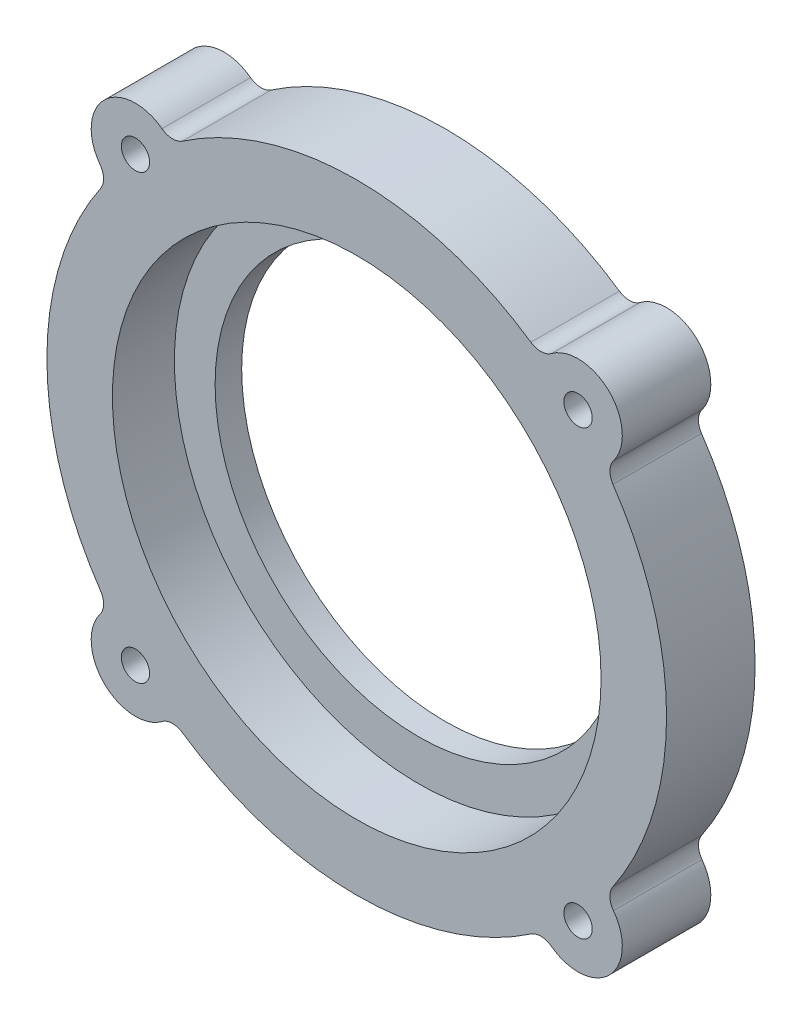
ISO-10303-21;
HEADER;
FILE_DESCRIPTION(('STEP AP214'),'2;1');
FILE_NAME('part.step','',(''),(''),'','','');
FILE_SCHEMA(('AUTOMOTIVE_DESIGN { 1 0 10303 214 1 1 1 1 }'));
ENDSEC;
DATA;
#1=APPLICATION_CONTEXT('core data for automotive mechanical design processes');
#2=APPLICATION_PROTOCOL_DEFINITION('international standard','automotive_design',2000,#1);
#3=PRODUCT_CONTEXT('',#1,'mechanical');
#4=PRODUCT('Part','Part','',(#3));
#5=PRODUCT_RELATED_PRODUCT_CATEGORY('part','',(#4));
#6=PRODUCT_DEFINITION_FORMATION('','',#4);
#7=PRODUCT_DEFINITION_CONTEXT('part definition',#1,'design');
#8=PRODUCT_DEFINITION('design','',#6,#7);
#9=PRODUCT_DEFINITION_SHAPE('','',#8);
#10=(LENGTH_UNIT() NAMED_UNIT(*) SI_UNIT(.MILLI.,.METRE.));
#11=(NAMED_UNIT(*) PLANE_ANGLE_UNIT() SI_UNIT($,.RADIAN.));
#12=(NAMED_UNIT(*) SI_UNIT($,.STERADIAN.) SOLID_ANGLE_UNIT());
#13=UNCERTAINTY_MEASURE_WITH_UNIT(LENGTH_MEASURE(1.E-05),#10,'distance_accuracy_value','');
#14=(GEOMETRIC_REPRESENTATION_CONTEXT(3) GLOBAL_UNCERTAINTY_ASSIGNED_CONTEXT((#13)) GLOBAL_UNIT_ASSIGNED_CONTEXT((#10,
#11,#12)) REPRESENTATION_CONTEXT('',''));
#15=CARTESIAN_POINT('',(0.,0.,0.));
#16=DIRECTION('',(0.,0.,1.));
#17=DIRECTION('',(1.,0.,0.));
#18=AXIS2_PLACEMENT_3D('',#15,#16,#17);
#19=CARTESIAN_POINT('',(0.,0.,10.));
#20=DIRECTION('',(0.,0.,-1.));
#21=DIRECTION('',(-1.,0.,0.));
#22=AXIS2_PLACEMENT_3D('',#19,#20,#21);
#23=CYLINDRICAL_SURFACE('',#22,23.);
#24=CARTESIAN_POINT('',(0.,0.,0.));
#25=DIRECTION('',(0.,0.,1.));
#26=DIRECTION('',(1.,0.,0.));
#27=AXIS2_PLACEMENT_3D('',#24,#25,#26);
#28=CIRCLE('',#27,23.);
#29=CARTESIAN_POINT('',(23.,0.,0.));
#30=VERTEX_POINT('',#29);
#31=EDGE_CURVE('E184',#30,#30,#28,.T.);
#32=ORIENTED_EDGE('',*,*,#31,.F.);
#33=EDGE_LOOP('',(#32));
#34=FACE_BOUND('',#33,.T.);
#35=CARTESIAN_POINT('',(0.,0.,3.));
#36=DIRECTION('',(0.,0.,1.));
#37=DIRECTION('',(1.,0.,0.));
#38=AXIS2_PLACEMENT_3D('',#35,#36,#37);
#39=CIRCLE('',#38,23.);
#40=CARTESIAN_POINT('',(23.,0.,3.));
#41=VERTEX_POINT('',#40);
#42=EDGE_CURVE('E37',#41,#41,#39,.T.);
#43=ORIENTED_EDGE('',*,*,#42,.T.);
#44=EDGE_LOOP('',(#43));
#45=FACE_BOUND('',#44,.T.);
#46=ADVANCED_FACE('F33',(#34,#45),#23,.F.);
#47=CARTESIAN_POINT('',(-27.8,-22.9,10.));
#48=DIRECTION('',(0.,0.,-1.));
#49=DIRECTION('',(-1.,0.,0.));
#50=AXIS2_PLACEMENT_3D('',#47,#48,#49);
#51=PLANE('',#50);
#52=CARTESIAN_POINT('',(0.,0.,10.));
#53=DIRECTION('',(0.,0.,1.));
#54=DIRECTION('',(1.,0.,0.));
#55=AXIS2_PLACEMENT_3D('',#52,#53,#54);
#56=CIRCLE('',#55,27.6);
#57=CARTESIAN_POINT('',(27.6,0.,10.));
#58=VERTEX_POINT('',#57);
#59=EDGE_CURVE('E441',#58,#58,#56,.T.);
#60=ORIENTED_EDGE('',*,*,#59,.F.);
#61=EDGE_LOOP('',(#60));
#62=FACE_BOUND('',#61,.T.);
#63=CARTESIAN_POINT('',(-30.6,-20.8,10.));
#64=DIRECTION('',(0.,0.,-1.));
#65=DIRECTION('',(-1.,0.,0.));
#66=AXIS2_PLACEMENT_3D('',#63,#64,#65);
#67=CIRCLE('',#66,2.);
#68=CARTESIAN_POINT('',(-28.945945945946,-19.6756756756757,10.));
#69=VERTEX_POINT('',#68);
#70=CARTESIAN_POINT('',(-29.,-22.,10.));
#71=VERTEX_POINT('',#70);
#72=EDGE_CURVE('E211',#69,#71,#67,.T.);
#73=ORIENTED_EDGE('',*,*,#72,.T.);
#74=CARTESIAN_POINT('',(-25.,-25.,10.));
#75=DIRECTION('',(0.,0.,1.));
#76=DIRECTION('',(1.,0.,0.));
#77=AXIS2_PLACEMENT_3D('',#74,#75,#76);
#78=CIRCLE('',#77,5.00000000000002);
#79=CARTESIAN_POINT('',(-22.,-29.,10.));
#80=VERTEX_POINT('',#79);
#81=EDGE_CURVE('E118',#71,#80,#78,.T.);
#82=ORIENTED_EDGE('',*,*,#81,.T.);
#83=CARTESIAN_POINT('',(-20.8,-30.6,10.));
#84=DIRECTION('',(0.,0.,-1.));
#85=DIRECTION('',(-1.,0.,0.));
#86=AXIS2_PLACEMENT_3D('',#83,#84,#85);
#87=CIRCLE('',#86,2.);
#88=CARTESIAN_POINT('',(-19.6756756756757,-28.945945945946,10.));
#89=VERTEX_POINT('',#88);
#90=EDGE_CURVE('E251',#80,#89,#87,.T.);
#91=ORIENTED_EDGE('',*,*,#90,.T.);
#92=CARTESIAN_POINT('',(0.,0.,10.));
#93=DIRECTION('',(0.,0.,1.));
#94=DIRECTION('',(1.,0.,0.));
#95=AXIS2_PLACEMENT_3D('',#92,#93,#94);
#96=CIRCLE('',#95,35.);
#97=CARTESIAN_POINT('',(19.6756756756757,-28.945945945946,10.));
#98=VERTEX_POINT('',#97);
#99=EDGE_CURVE('E270',#89,#98,#96,.T.);
#100=ORIENTED_EDGE('',*,*,#99,.T.);
#101=CARTESIAN_POINT('',(20.8,-30.6,10.));
#102=DIRECTION('',(0.,0.,-1.));
#103=DIRECTION('',(-1.,0.,0.));
#104=AXIS2_PLACEMENT_3D('',#101,#102,#103);
#105=CIRCLE('',#104,2.);
#106=CARTESIAN_POINT('',(22.,-29.,10.));
#107=VERTEX_POINT('',#106);
#108=EDGE_CURVE('E267',#98,#107,#105,.T.);
#109=ORIENTED_EDGE('',*,*,#108,.T.);
#110=CARTESIAN_POINT('',(25.,-25.,10.));
#111=DIRECTION('',(0.,0.,1.));
#112=DIRECTION('',(1.,0.,0.));
#113=AXIS2_PLACEMENT_3D('',#110,#111,#112);
#114=CIRCLE('',#113,5.00000000000002);
#115=CARTESIAN_POINT('',(29.,-22.,10.));
#116=VERTEX_POINT('',#115);
#117=EDGE_CURVE('E269',#107,#116,#114,.T.);
#118=ORIENTED_EDGE('',*,*,#117,.T.);
#119=CARTESIAN_POINT('',(30.6,-20.8,10.));
#120=DIRECTION('',(0.,0.,-1.));
#121=DIRECTION('',(-1.,0.,0.));
#122=AXIS2_PLACEMENT_3D('',#119,#120,#121);
#123=CIRCLE('',#122,2.);
#124=CARTESIAN_POINT('',(28.945945945946,-19.6756756756757,10.));
#125=VERTEX_POINT('',#124);
#126=EDGE_CURVE('E272',#116,#125,#123,.T.);
#127=ORIENTED_EDGE('',*,*,#126,.T.);
#128=CARTESIAN_POINT('',(0.,0.,10.));
#129=DIRECTION('',(0.,0.,1.));
#130=DIRECTION('',(1.,0.,0.));
#131=AXIS2_PLACEMENT_3D('',#128,#129,#130);
#132=CIRCLE('',#131,35.);
#133=CARTESIAN_POINT('',(28.9459459459459,19.6756756756757,10.));
#134=VERTEX_POINT('',#133);
#135=EDGE_CURVE('E278',#125,#134,#132,.T.);
#136=ORIENTED_EDGE('',*,*,#135,.T.);
#137=CARTESIAN_POINT('',(30.6,20.8,10.));
#138=DIRECTION('',(0.,0.,-1.));
#139=DIRECTION('',(-1.,0.,0.));
#140=AXIS2_PLACEMENT_3D('',#137,#138,#139);
#141=CIRCLE('',#140,2.);
#142=CARTESIAN_POINT('',(29.,22.,10.));
#143=VERTEX_POINT('',#142);
#144=EDGE_CURVE('E280',#134,#143,#141,.T.);
#145=ORIENTED_EDGE('',*,*,#144,.T.);
#146=CARTESIAN_POINT('',(25.,25.,10.));
#147=DIRECTION('',(0.,0.,1.));
#148=DIRECTION('',(1.,0.,0.));
#149=AXIS2_PLACEMENT_3D('',#146,#147,#148);
#150=CIRCLE('',#149,5.00000000000001);
#151=CARTESIAN_POINT('',(22.,29.,10.));
#152=VERTEX_POINT('',#151);
#153=EDGE_CURVE('E282',#143,#152,#150,.T.);
#154=ORIENTED_EDGE('',*,*,#153,.T.);
#155=CARTESIAN_POINT('',(20.8,30.6,10.));
#156=DIRECTION('',(0.,0.,-1.));
#157=DIRECTION('',(-1.,0.,0.));
#158=AXIS2_PLACEMENT_3D('',#155,#156,#157);
#159=CIRCLE('',#158,2.);
#160=CARTESIAN_POINT('',(19.6756756756757,28.945945945946,10.));
#161=VERTEX_POINT('',#160);
#162=EDGE_CURVE('E284',#152,#161,#159,.T.);
#163=ORIENTED_EDGE('',*,*,#162,.T.);
#164=CARTESIAN_POINT('',(0.,0.,10.));
#165=DIRECTION('',(0.,0.,1.));
#166=DIRECTION('',(1.,0.,0.));
#167=AXIS2_PLACEMENT_3D('',#164,#165,#166);
#168=CIRCLE('',#167,35.);
#169=CARTESIAN_POINT('',(-19.6756756756757,28.9459459459459,10.));
#170=VERTEX_POINT('',#169);
#171=EDGE_CURVE('E286',#161,#170,#168,.T.);
#172=ORIENTED_EDGE('',*,*,#171,.T.);
#173=CARTESIAN_POINT('',(-20.8,30.6,10.));
#174=DIRECTION('',(0.,0.,-1.));
#175=DIRECTION('',(-1.,0.,0.));
#176=AXIS2_PLACEMENT_3D('',#173,#174,#175);
#177=CIRCLE('',#176,2.);
#178=CARTESIAN_POINT('',(-22.,29.,10.));
#179=VERTEX_POINT('',#178);
#180=EDGE_CURVE('E162',#170,#179,#177,.T.);
#181=ORIENTED_EDGE('',*,*,#180,.T.);
#182=CARTESIAN_POINT('',(-25.,25.,10.));
#183=DIRECTION('',(0.,0.,1.));
#184=DIRECTION('',(1.,0.,0.));
#185=AXIS2_PLACEMENT_3D('',#182,#183,#184);
#186=CIRCLE('',#185,4.99999999999999);
#187=CARTESIAN_POINT('',(-29.,22.,10.));
#188=VERTEX_POINT('',#187);
#189=EDGE_CURVE('E155',#179,#188,#186,.T.);
#190=ORIENTED_EDGE('',*,*,#189,.T.);
#191=CARTESIAN_POINT('',(-30.6,20.8,10.));
#192=DIRECTION('',(0.,0.,-1.));
#193=DIRECTION('',(1.,0.,0.));
#194=AXIS2_PLACEMENT_3D('',#191,#192,#193);
#195=CIRCLE('',#194,2.);
#196=CARTESIAN_POINT('',(-28.945945945946,19.6756756756757,10.));
#197=VERTEX_POINT('',#196);
#198=EDGE_CURVE('E160',#188,#197,#195,.T.);
#199=ORIENTED_EDGE('',*,*,#198,.T.);
#200=CARTESIAN_POINT('',(0.,0.,10.));
#201=DIRECTION('',(0.,0.,1.));
#202=DIRECTION('',(1.,0.,0.));
#203=AXIS2_PLACEMENT_3D('',#200,#201,#202);
#204=CIRCLE('',#203,35.);
#205=EDGE_CURVE('E51',#197,#69,#204,.T.);
#206=ORIENTED_EDGE('',*,*,#205,.T.);
#207=EDGE_LOOP('',(#73,#82,#91,#100,#109,#118,#127,#136,#145,#154,#163,#172,#181,#190,#199,#206));
#208=FACE_BOUND('',#207,.T.);
#209=CARTESIAN_POINT('',(-25.,25.,10.));
#210=DIRECTION('',(0.,0.,1.));
#211=DIRECTION('',(1.,0.,0.));
#212=AXIS2_PLACEMENT_3D('',#209,#210,#211);
#213=CIRCLE('',#212,1.6);
#214=CARTESIAN_POINT('',(-23.4,25.,10.));
#215=VERTEX_POINT('',#214);
#216=EDGE_CURVE('E338',#215,#215,#213,.T.);
#217=ORIENTED_EDGE('',*,*,#216,.F.);
#218=EDGE_LOOP('',(#217));
#219=FACE_BOUND('',#218,.T.);
#220=CARTESIAN_POINT('',(25.,25.,10.));
#221=DIRECTION('',(0.,0.,1.));
#222=DIRECTION('',(1.,0.,0.));
#223=AXIS2_PLACEMENT_3D('',#220,#221,#222);
#224=CIRCLE('',#223,1.6);
#225=CARTESIAN_POINT('',(26.6,25.,10.));
#226=VERTEX_POINT('',#225);
#227=EDGE_CURVE('E339',#226,#226,#224,.T.);
#228=ORIENTED_EDGE('',*,*,#227,.F.);
#229=EDGE_LOOP('',(#228));
#230=FACE_BOUND('',#229,.T.);
#231=CARTESIAN_POINT('',(-25.,-25.,10.));
#232=DIRECTION('',(0.,0.,1.));
#233=DIRECTION('',(1.,0.,0.));
#234=AXIS2_PLACEMENT_3D('',#231,#232,#233);
#235=CIRCLE('',#234,1.6);
#236=CARTESIAN_POINT('',(-23.4,-25.,10.));
#237=VERTEX_POINT('',#236);
#238=EDGE_CURVE('E367',#237,#237,#235,.T.);
#239=ORIENTED_EDGE('',*,*,#238,.F.);
#240=EDGE_LOOP('',(#239));
#241=FACE_BOUND('',#240,.T.);
#242=CARTESIAN_POINT('',(25.,-25.,10.));
#243=DIRECTION('',(0.,0.,1.));
#244=DIRECTION('',(1.,0.,0.));
#245=AXIS2_PLACEMENT_3D('',#242,#243,#244);
#246=CIRCLE('',#245,1.6);
#247=CARTESIAN_POINT('',(26.6,-25.,10.));
#248=VERTEX_POINT('',#247);
#249=EDGE_CURVE('E359',#248,#248,#246,.T.);
#250=ORIENTED_EDGE('',*,*,#249,.F.);
#251=EDGE_LOOP('',(#250));
#252=FACE_BOUND('',#251,.T.);
#253=ADVANCED_FACE('F157',(#62,#208,#219,#230,#241,#252),#51,.F.);
#254=CARTESIAN_POINT('',(-27.8,-22.9,0.));
#255=DIRECTION('',(0.,0.,-1.));
#256=DIRECTION('',(-1.,0.,0.));
#257=AXIS2_PLACEMENT_3D('',#254,#255,#256);
#258=PLANE('',#257);
#259=CARTESIAN_POINT('',(-25.,-25.,0.));
#260=DIRECTION('',(0.,0.,1.));
#261=DIRECTION('',(1.,0.,0.));
#262=AXIS2_PLACEMENT_3D('',#259,#260,#261);
#263=CIRCLE('',#262,1.6);
#264=CARTESIAN_POINT('',(-23.4,-25.,0.));
#265=VERTEX_POINT('',#264);
#266=EDGE_CURVE('E333',#265,#265,#263,.T.);
#267=ORIENTED_EDGE('',*,*,#266,.T.);
#268=EDGE_LOOP('',(#267));
#269=FACE_BOUND('',#268,.T.);
#270=CARTESIAN_POINT('',(-25.,25.,0.));
#271=DIRECTION('',(0.,0.,1.));
#272=DIRECTION('',(1.,0.,0.));
#273=AXIS2_PLACEMENT_3D('',#270,#271,#272);
#274=CIRCLE('',#273,1.6);
#275=CARTESIAN_POINT('',(-23.4,25.,0.));
#276=VERTEX_POINT('',#275);
#277=EDGE_CURVE('E336',#276,#276,#274,.T.);
#278=ORIENTED_EDGE('',*,*,#277,.T.);
#279=EDGE_LOOP('',(#278));
#280=FACE_BOUND('',#279,.T.);
#281=CARTESIAN_POINT('',(-30.6,-20.8,0.));
#282=DIRECTION('',(0.,0.,-1.));
#283=DIRECTION('',(-1.,0.,0.));
#284=AXIS2_PLACEMENT_3D('',#281,#282,#283);
#285=CIRCLE('',#284,2.);
#286=CARTESIAN_POINT('',(-28.945945945946,-19.6756756756757,0.));
#287=VERTEX_POINT('',#286);
#288=CARTESIAN_POINT('',(-29.,-22.,0.));
#289=VERTEX_POINT('',#288);
#290=EDGE_CURVE('E180',#287,#289,#285,.T.);
#291=ORIENTED_EDGE('',*,*,#290,.F.);
#292=CARTESIAN_POINT('',(0.,0.,0.));
#293=DIRECTION('',(0.,0.,1.));
#294=DIRECTION('',(1.,0.,0.));
#295=AXIS2_PLACEMENT_3D('',#292,#293,#294);
#296=CIRCLE('',#295,35.);
#297=CARTESIAN_POINT('',(-28.945945945946,19.6756756756757,0.));
#298=VERTEX_POINT('',#297);
#299=EDGE_CURVE('E110',#298,#287,#296,.T.);
#300=ORIENTED_EDGE('',*,*,#299,.F.);
#301=CARTESIAN_POINT('',(-30.6,20.8,0.));
#302=DIRECTION('',(0.,0.,-1.));
#303=DIRECTION('',(1.,0.,0.));
#304=AXIS2_PLACEMENT_3D('',#301,#302,#303);
#305=CIRCLE('',#304,2.);
#306=CARTESIAN_POINT('',(-29.,22.,0.));
#307=VERTEX_POINT('',#306);
#308=EDGE_CURVE('E104',#307,#298,#305,.T.);
#309=ORIENTED_EDGE('',*,*,#308,.F.);
#310=CARTESIAN_POINT('',(-25.,25.,0.));
#311=DIRECTION('',(0.,0.,1.));
#312=DIRECTION('',(1.,0.,0.));
#313=AXIS2_PLACEMENT_3D('',#310,#311,#312);
#314=CIRCLE('',#313,4.99999999999999);
#315=CARTESIAN_POINT('',(-22.,29.,0.));
#316=VERTEX_POINT('',#315);
#317=EDGE_CURVE('E170',#316,#307,#314,.T.);
#318=ORIENTED_EDGE('',*,*,#317,.F.);
#319=CARTESIAN_POINT('',(-20.8,30.6,0.));
#320=DIRECTION('',(0.,0.,-1.));
#321=DIRECTION('',(-1.,0.,0.));
#322=AXIS2_PLACEMENT_3D('',#319,#320,#321);
#323=CIRCLE('',#322,2.);
#324=CARTESIAN_POINT('',(-19.6756756756757,28.9459459459459,0.));
#325=VERTEX_POINT('',#324);
#326=EDGE_CURVE('E206',#325,#316,#323,.T.);
#327=ORIENTED_EDGE('',*,*,#326,.F.);
#328=CARTESIAN_POINT('',(0.,0.,0.));
#329=DIRECTION('',(0.,0.,1.));
#330=DIRECTION('',(1.,0.,0.));
#331=AXIS2_PLACEMENT_3D('',#328,#329,#330);
#332=CIRCLE('',#331,35.);
#333=CARTESIAN_POINT('',(19.6756756756757,28.945945945946,0.));
#334=VERTEX_POINT('',#333);
#335=EDGE_CURVE('E204',#334,#325,#332,.T.);
#336=ORIENTED_EDGE('',*,*,#335,.F.);
#337=CARTESIAN_POINT('',(20.8,30.6,0.));
#338=DIRECTION('',(0.,0.,-1.));
#339=DIRECTION('',(-1.,0.,0.));
#340=AXIS2_PLACEMENT_3D('',#337,#338,#339);
#341=CIRCLE('',#340,2.);
#342=CARTESIAN_POINT('',(22.,29.,0.));
#343=VERTEX_POINT('',#342);
#344=EDGE_CURVE('E202',#343,#334,#341,.T.);
#345=ORIENTED_EDGE('',*,*,#344,.F.);
#346=CARTESIAN_POINT('',(25.,25.,0.));
#347=DIRECTION('',(0.,0.,1.));
#348=DIRECTION('',(1.,0.,0.));
#349=AXIS2_PLACEMENT_3D('',#346,#347,#348);
#350=CIRCLE('',#349,5.00000000000001);
#351=CARTESIAN_POINT('',(29.,22.,0.));
#352=VERTEX_POINT('',#351);
#353=EDGE_CURVE('E200',#352,#343,#350,.T.);
#354=ORIENTED_EDGE('',*,*,#353,.F.);
#355=CARTESIAN_POINT('',(30.6,20.8,0.));
#356=DIRECTION('',(0.,0.,-1.));
#357=DIRECTION('',(-1.,0.,0.));
#358=AXIS2_PLACEMENT_3D('',#355,#356,#357);
#359=CIRCLE('',#358,2.);
#360=CARTESIAN_POINT('',(28.9459459459459,19.6756756756757,0.));
#361=VERTEX_POINT('',#360);
#362=EDGE_CURVE('E198',#361,#352,#359,.T.);
#363=ORIENTED_EDGE('',*,*,#362,.F.);
#364=CARTESIAN_POINT('',(0.,0.,0.));
#365=DIRECTION('',(0.,0.,1.));
#366=DIRECTION('',(1.,0.,0.));
#367=AXIS2_PLACEMENT_3D('',#364,#365,#366);
#368=CIRCLE('',#367,35.);
#369=CARTESIAN_POINT('',(28.945945945946,-19.6756756756757,0.));
#370=VERTEX_POINT('',#369);
#371=EDGE_CURVE('E196',#370,#361,#368,.T.);
#372=ORIENTED_EDGE('',*,*,#371,.F.);
#373=CARTESIAN_POINT('',(30.6,-20.8,0.));
#374=DIRECTION('',(0.,0.,-1.));
#375=DIRECTION('',(-1.,0.,0.));
#376=AXIS2_PLACEMENT_3D('',#373,#374,#375);
#377=CIRCLE('',#376,2.);
#378=CARTESIAN_POINT('',(29.,-22.,0.));
#379=VERTEX_POINT('',#378);
#380=EDGE_CURVE('E194',#379,#370,#377,.T.);
#381=ORIENTED_EDGE('',*,*,#380,.F.);
#382=CARTESIAN_POINT('',(25.,-25.,0.));
#383=DIRECTION('',(0.,0.,1.));
#384=DIRECTION('',(1.,0.,0.));
#385=AXIS2_PLACEMENT_3D('',#382,#383,#384);
#386=CIRCLE('',#385,5.00000000000002);
#387=CARTESIAN_POINT('',(22.,-29.,0.));
#388=VERTEX_POINT('',#387);
#389=EDGE_CURVE('E192',#388,#379,#386,.T.);
#390=ORIENTED_EDGE('',*,*,#389,.F.);
#391=CARTESIAN_POINT('',(20.8,-30.6,0.));
#392=DIRECTION('',(0.,0.,-1.));
#393=DIRECTION('',(-1.,0.,0.));
#394=AXIS2_PLACEMENT_3D('',#391,#392,#393);
#395=CIRCLE('',#394,2.);
#396=CARTESIAN_POINT('',(19.6756756756757,-28.945945945946,0.));
#397=VERTEX_POINT('',#396);
#398=EDGE_CURVE('E190',#397,#388,#395,.T.);
#399=ORIENTED_EDGE('',*,*,#398,.F.);
#400=CARTESIAN_POINT('',(0.,0.,0.));
#401=DIRECTION('',(0.,0.,1.));
#402=DIRECTION('',(1.,0.,0.));
#403=AXIS2_PLACEMENT_3D('',#400,#401,#402);
#404=CIRCLE('',#403,35.);
#405=CARTESIAN_POINT('',(-19.6756756756757,-28.945945945946,0.));
#406=VERTEX_POINT('',#405);
#407=EDGE_CURVE('E188',#406,#397,#404,.T.);
#408=ORIENTED_EDGE('',*,*,#407,.F.);
#409=CARTESIAN_POINT('',(-20.8,-30.6,0.));
#410=DIRECTION('',(0.,0.,-1.));
#411=DIRECTION('',(-1.,0.,0.));
#412=AXIS2_PLACEMENT_3D('',#409,#410,#411);
#413=CIRCLE('',#412,2.);
#414=CARTESIAN_POINT('',(-22.,-29.,0.));
#415=VERTEX_POINT('',#414);
#416=EDGE_CURVE('E186',#415,#406,#413,.T.);
#417=ORIENTED_EDGE('',*,*,#416,.F.);
#418=CARTESIAN_POINT('',(-25.,-25.,0.));
#419=DIRECTION('',(0.,0.,1.));
#420=DIRECTION('',(1.,0.,0.));
#421=AXIS2_PLACEMENT_3D('',#418,#419,#420);
#422=CIRCLE('',#421,5.00000000000002);
#423=EDGE_CURVE('E183',#289,#415,#422,.T.);
#424=ORIENTED_EDGE('',*,*,#423,.F.);
#425=EDGE_LOOP('',(#291,#300,#309,#318,#327,#336,#345,#354,#363,#372,#381,#390,#399,#408,#417,#424));
#426=FACE_BOUND('',#425,.T.);
#427=ORIENTED_EDGE('',*,*,#31,.T.);
#428=EDGE_LOOP('',(#427));
#429=FACE_BOUND('',#428,.T.);
#430=CARTESIAN_POINT('',(25.,25.,0.));
#431=DIRECTION('',(0.,0.,1.));
#432=DIRECTION('',(1.,0.,0.));
#433=AXIS2_PLACEMENT_3D('',#430,#431,#432);
#434=CIRCLE('',#433,1.6);
#435=CARTESIAN_POINT('',(26.6,25.,0.));
#436=VERTEX_POINT('',#435);
#437=EDGE_CURVE('E344',#436,#436,#434,.T.);
#438=ORIENTED_EDGE('',*,*,#437,.T.);
#439=EDGE_LOOP('',(#438));
#440=FACE_BOUND('',#439,.T.);
#441=CARTESIAN_POINT('',(25.,-25.,0.));
#442=DIRECTION('',(0.,0.,1.));
#443=DIRECTION('',(1.,0.,0.));
#444=AXIS2_PLACEMENT_3D('',#441,#442,#443);
#445=CIRCLE('',#444,1.6);
#446=CARTESIAN_POINT('',(26.6,-25.,0.));
#447=VERTEX_POINT('',#446);
#448=EDGE_CURVE('E357',#447,#447,#445,.T.);
#449=ORIENTED_EDGE('',*,*,#448,.T.);
#450=EDGE_LOOP('',(#449));
#451=FACE_BOUND('',#450,.T.);
#452=ADVANCED_FACE('F255',(#269,#280,#426,#429,#440,#451),#258,.T.);
#453=CARTESIAN_POINT('',(-30.6,-20.8,10.));
#454=DIRECTION('',(0.,0.,-1.));
#455=DIRECTION('',(-1.,0.,0.));
#456=AXIS2_PLACEMENT_3D('',#453,#454,#455);
#457=CYLINDRICAL_SURFACE('',#456,2.);
#458=ORIENTED_EDGE('',*,*,#290,.T.);
#459=DIRECTION('',(0.,0.,-1.));
#460=VECTOR('',#459,1.);
#461=CARTESIAN_POINT('',(-29.,-22.,10.));
#462=LINE('',#461,#460);
#463=EDGE_CURVE('E11',#71,#289,#462,.T.);
#464=ORIENTED_EDGE('',*,*,#463,.F.);
#465=ORIENTED_EDGE('',*,*,#72,.F.);
#466=DIRECTION('',(0.,0.,-1.));
#467=VECTOR('',#466,1.);
#468=CARTESIAN_POINT('',(-28.945945945946,-19.6756756756757,10.));
#469=LINE('',#468,#467);
#470=EDGE_CURVE('E176',#69,#287,#469,.T.);
#471=ORIENTED_EDGE('',*,*,#470,.T.);
#472=EDGE_LOOP('',(#458,#464,#465,#471));
#473=FACE_BOUND('',#472,.T.);
#474=ADVANCED_FACE('F35',(#473),#457,.F.);
#475=CARTESIAN_POINT('',(-25.,-25.,10.));
#476=DIRECTION('',(0.,0.,-1.));
#477=DIRECTION('',(-1.,0.,0.));
#478=AXIS2_PLACEMENT_3D('',#475,#476,#477);
#479=CYLINDRICAL_SURFACE('',#478,5.00000000000002);
#480=ORIENTED_EDGE('',*,*,#423,.T.);
#481=DIRECTION('',(0.,0.,-1.));
#482=VECTOR('',#481,1.);
#483=CARTESIAN_POINT('',(-22.,-29.,10.));
#484=LINE('',#483,#482);
#485=EDGE_CURVE('E43',#80,#415,#484,.T.);
#486=ORIENTED_EDGE('',*,*,#485,.F.);
#487=ORIENTED_EDGE('',*,*,#81,.F.);
#488=ORIENTED_EDGE('',*,*,#463,.T.);
#489=EDGE_LOOP('',(#480,#486,#487,#488));
#490=FACE_BOUND('',#489,.T.);
#491=ADVANCED_FACE('F329',(#490),#479,.T.);
#492=CARTESIAN_POINT('',(-20.8,-30.6,10.));
#493=DIRECTION('',(0.,0.,-1.));
#494=DIRECTION('',(-1.,0.,0.));
#495=AXIS2_PLACEMENT_3D('',#492,#493,#494);
#496=CYLINDRICAL_SURFACE('',#495,2.);
#497=ORIENTED_EDGE('',*,*,#416,.T.);
#498=DIRECTION('',(0.,0.,-1.));
#499=VECTOR('',#498,1.);
#500=CARTESIAN_POINT('',(-19.6756756756757,-28.945945945946,10.));
#501=LINE('',#500,#499);
#502=EDGE_CURVE('E242',#89,#406,#501,.T.);
#503=ORIENTED_EDGE('',*,*,#502,.F.);
#504=ORIENTED_EDGE('',*,*,#90,.F.);
#505=ORIENTED_EDGE('',*,*,#485,.T.);
#506=EDGE_LOOP('',(#497,#503,#504,#505));
#507=FACE_BOUND('',#506,.T.);
#508=ADVANCED_FACE('F249',(#507),#496,.F.);
#509=CARTESIAN_POINT('',(0.,0.,10.));
#510=DIRECTION('',(0.,0.,-1.));
#511=DIRECTION('',(-1.,0.,0.));
#512=AXIS2_PLACEMENT_3D('',#509,#510,#511);
#513=CYLINDRICAL_SURFACE('',#512,35.);
#514=ORIENTED_EDGE('',*,*,#407,.T.);
#515=DIRECTION('',(0.,0.,-1.));
#516=VECTOR('',#515,1.);
#517=CARTESIAN_POINT('',(19.6756756756757,-28.945945945946,10.));
#518=LINE('',#517,#516);
#519=EDGE_CURVE('E239',#98,#397,#518,.T.);
#520=ORIENTED_EDGE('',*,*,#519,.F.);
#521=ORIENTED_EDGE('',*,*,#99,.F.);
#522=ORIENTED_EDGE('',*,*,#502,.T.);
#523=EDGE_LOOP('',(#514,#520,#521,#522));
#524=FACE_BOUND('',#523,.T.);
#525=ADVANCED_FACE('F261',(#524),#513,.T.);
#526=CARTESIAN_POINT('',(20.8,-30.6,10.));
#527=DIRECTION('',(0.,0.,-1.));
#528=DIRECTION('',(-1.,0.,0.));
#529=AXIS2_PLACEMENT_3D('',#526,#527,#528);
#530=CYLINDRICAL_SURFACE('',#529,2.);
#531=ORIENTED_EDGE('',*,*,#398,.T.);
#532=DIRECTION('',(0.,0.,-1.));
#533=VECTOR('',#532,1.);
#534=CARTESIAN_POINT('',(22.,-29.,10.));
#535=LINE('',#534,#533);
#536=EDGE_CURVE('E236',#107,#388,#535,.T.);
#537=ORIENTED_EDGE('',*,*,#536,.F.);
#538=ORIENTED_EDGE('',*,*,#108,.F.);
#539=ORIENTED_EDGE('',*,*,#519,.T.);
#540=EDGE_LOOP('',(#531,#537,#538,#539));
#541=FACE_BOUND('',#540,.T.);
#542=ADVANCED_FACE('F265',(#541),#530,.F.);
#543=CARTESIAN_POINT('',(25.,-25.,10.));
#544=DIRECTION('',(0.,0.,-1.));
#545=DIRECTION('',(-1.,0.,0.));
#546=AXIS2_PLACEMENT_3D('',#543,#544,#545);
#547=CYLINDRICAL_SURFACE('',#546,5.00000000000002);
#548=ORIENTED_EDGE('',*,*,#389,.T.);
#549=DIRECTION('',(0.,0.,-1.));
#550=VECTOR('',#549,1.);
#551=CARTESIAN_POINT('',(29.,-22.,10.));
#552=LINE('',#551,#550);
#553=EDGE_CURVE('E233',#116,#379,#552,.T.);
#554=ORIENTED_EDGE('',*,*,#553,.F.);
#555=ORIENTED_EDGE('',*,*,#117,.F.);
#556=ORIENTED_EDGE('',*,*,#536,.T.);
#557=EDGE_LOOP('',(#548,#554,#555,#556));
#558=FACE_BOUND('',#557,.T.);
#559=ADVANCED_FACE('F480',(#558),#547,.T.);
#560=CARTESIAN_POINT('',(30.6,-20.8,10.));
#561=DIRECTION('',(0.,0.,-1.));
#562=DIRECTION('',(-1.,0.,0.));
#563=AXIS2_PLACEMENT_3D('',#560,#561,#562);
#564=CYLINDRICAL_SURFACE('',#563,2.);
#565=ORIENTED_EDGE('',*,*,#380,.T.);
#566=DIRECTION('',(0.,0.,-1.));
#567=VECTOR('',#566,1.);
#568=CARTESIAN_POINT('',(28.945945945946,-19.6756756756757,10.));
#569=LINE('',#568,#567);
#570=EDGE_CURVE('E230',#125,#370,#569,.T.);
#571=ORIENTED_EDGE('',*,*,#570,.F.);
#572=ORIENTED_EDGE('',*,*,#126,.F.);
#573=ORIENTED_EDGE('',*,*,#553,.T.);
#574=EDGE_LOOP('',(#565,#571,#572,#573));
#575=FACE_BOUND('',#574,.T.);
#576=ADVANCED_FACE('F488',(#575),#564,.F.);
#577=CARTESIAN_POINT('',(0.,0.,10.));
#578=DIRECTION('',(0.,0.,-1.));
#579=DIRECTION('',(-1.,0.,0.));
#580=AXIS2_PLACEMENT_3D('',#577,#578,#579);
#581=CYLINDRICAL_SURFACE('',#580,35.);
#582=ORIENTED_EDGE('',*,*,#371,.T.);
#583=DIRECTION('',(0.,0.,-1.));
#584=VECTOR('',#583,1.);
#585=CARTESIAN_POINT('',(28.9459459459459,19.6756756756757,10.));
#586=LINE('',#585,#584);
#587=EDGE_CURVE('E227',#134,#361,#586,.T.);
#588=ORIENTED_EDGE('',*,*,#587,.F.);
#589=ORIENTED_EDGE('',*,*,#135,.F.);
#590=ORIENTED_EDGE('',*,*,#570,.T.);
#591=EDGE_LOOP('',(#582,#588,#589,#590));
#592=FACE_BOUND('',#591,.T.);
#593=ADVANCED_FACE('F497',(#592),#581,.T.);
#594=CARTESIAN_POINT('',(30.6,20.8,10.));
#595=DIRECTION('',(0.,0.,-1.));
#596=DIRECTION('',(-1.,0.,0.));
#597=AXIS2_PLACEMENT_3D('',#594,#595,#596);
#598=CYLINDRICAL_SURFACE('',#597,2.);
#599=ORIENTED_EDGE('',*,*,#362,.T.);
#600=DIRECTION('',(0.,0.,-1.));
#601=VECTOR('',#600,1.);
#602=CARTESIAN_POINT('',(29.,22.,10.));
#603=LINE('',#602,#601);
#604=EDGE_CURVE('E224',#143,#352,#603,.T.);
#605=ORIENTED_EDGE('',*,*,#604,.F.);
#606=ORIENTED_EDGE('',*,*,#144,.F.);
#607=ORIENTED_EDGE('',*,*,#587,.T.);
#608=EDGE_LOOP('',(#599,#605,#606,#607));
#609=FACE_BOUND('',#608,.T.);
#610=ADVANCED_FACE('F506',(#609),#598,.F.);
#611=CARTESIAN_POINT('',(25.,25.,10.));
#612=DIRECTION('',(0.,0.,-1.));
#613=DIRECTION('',(-1.,0.,0.));
#614=AXIS2_PLACEMENT_3D('',#611,#612,#613);
#615=CYLINDRICAL_SURFACE('',#614,5.00000000000001);
#616=ORIENTED_EDGE('',*,*,#353,.T.);
#617=DIRECTION('',(0.,0.,-1.));
#618=VECTOR('',#617,1.);
#619=CARTESIAN_POINT('',(22.,29.,10.));
#620=LINE('',#619,#618);
#621=EDGE_CURVE('E221',#152,#343,#620,.T.);
#622=ORIENTED_EDGE('',*,*,#621,.F.);
#623=ORIENTED_EDGE('',*,*,#153,.F.);
#624=ORIENTED_EDGE('',*,*,#604,.T.);
#625=EDGE_LOOP('',(#616,#622,#623,#624));
#626=FACE_BOUND('',#625,.T.);
#627=ADVANCED_FACE('F515',(#626),#615,.T.);
#628=CARTESIAN_POINT('',(20.8,30.6,10.));
#629=DIRECTION('',(0.,0.,-1.));
#630=DIRECTION('',(-1.,0.,0.));
#631=AXIS2_PLACEMENT_3D('',#628,#629,#630);
#632=CYLINDRICAL_SURFACE('',#631,2.);
#633=ORIENTED_EDGE('',*,*,#344,.T.);
#634=DIRECTION('',(0.,0.,-1.));
#635=VECTOR('',#634,1.);
#636=CARTESIAN_POINT('',(19.6756756756757,28.945945945946,10.));
#637=LINE('',#636,#635);
#638=EDGE_CURVE('E218',#161,#334,#637,.T.);
#639=ORIENTED_EDGE('',*,*,#638,.F.);
#640=ORIENTED_EDGE('',*,*,#162,.F.);
#641=ORIENTED_EDGE('',*,*,#621,.T.);
#642=EDGE_LOOP('',(#633,#639,#640,#641));
#643=FACE_BOUND('',#642,.T.);
#644=ADVANCED_FACE('F524',(#643),#632,.F.);
#645=CARTESIAN_POINT('',(0.,0.,10.));
#646=DIRECTION('',(0.,0.,-1.));
#647=DIRECTION('',(-1.,0.,0.));
#648=AXIS2_PLACEMENT_3D('',#645,#646,#647);
#649=CYLINDRICAL_SURFACE('',#648,35.);
#650=ORIENTED_EDGE('',*,*,#335,.T.);
#651=DIRECTION('',(0.,0.,-1.));
#652=VECTOR('',#651,1.);
#653=CARTESIAN_POINT('',(-19.6756756756757,28.9459459459459,10.));
#654=LINE('',#653,#652);
#655=EDGE_CURVE('E215',#170,#325,#654,.T.);
#656=ORIENTED_EDGE('',*,*,#655,.F.);
#657=ORIENTED_EDGE('',*,*,#171,.F.);
#658=ORIENTED_EDGE('',*,*,#638,.T.);
#659=EDGE_LOOP('',(#650,#656,#657,#658));
#660=FACE_BOUND('',#659,.T.);
#661=ADVANCED_FACE('F292',(#660),#649,.T.);
#662=CARTESIAN_POINT('',(-20.8,30.6,10.));
#663=DIRECTION('',(0.,0.,-1.));
#664=DIRECTION('',(-1.,0.,0.));
#665=AXIS2_PLACEMENT_3D('',#662,#663,#664);
#666=CYLINDRICAL_SURFACE('',#665,2.);
#667=ORIENTED_EDGE('',*,*,#326,.T.);
#668=DIRECTION('',(0.,0.,-1.));
#669=VECTOR('',#668,1.);
#670=CARTESIAN_POINT('',(-22.,29.,10.));
#671=LINE('',#670,#669);
#672=EDGE_CURVE('E171',#179,#316,#671,.T.);
#673=ORIENTED_EDGE('',*,*,#672,.F.);
#674=ORIENTED_EDGE('',*,*,#180,.F.);
#675=ORIENTED_EDGE('',*,*,#655,.T.);
#676=EDGE_LOOP('',(#667,#673,#674,#675));
#677=FACE_BOUND('',#676,.T.);
#678=ADVANCED_FACE('F296',(#677),#666,.F.);
#679=CARTESIAN_POINT('',(-25.,25.,10.));
#680=DIRECTION('',(0.,0.,-1.));
#681=DIRECTION('',(-1.,0.,0.));
#682=AXIS2_PLACEMENT_3D('',#679,#680,#681);
#683=CYLINDRICAL_SURFACE('',#682,4.99999999999999);
#684=ORIENTED_EDGE('',*,*,#317,.T.);
#685=DIRECTION('',(0.,0.,-1.));
#686=VECTOR('',#685,1.);
#687=CARTESIAN_POINT('',(-29.,22.,10.));
#688=LINE('',#687,#686);
#689=EDGE_CURVE('E167',#188,#307,#688,.T.);
#690=ORIENTED_EDGE('',*,*,#689,.F.);
#691=ORIENTED_EDGE('',*,*,#189,.F.);
#692=ORIENTED_EDGE('',*,*,#672,.T.);
#693=EDGE_LOOP('',(#684,#690,#691,#692));
#694=FACE_BOUND('',#693,.T.);
#695=ADVANCED_FACE('F168',(#694),#683,.T.);
#696=CARTESIAN_POINT('',(-30.6,20.8,10.));
#697=DIRECTION('',(0.,0.,-1.));
#698=DIRECTION('',(-1.,0.,0.));
#699=AXIS2_PLACEMENT_3D('',#696,#697,#698);
#700=CYLINDRICAL_SURFACE('',#699,2.);
#701=ORIENTED_EDGE('',*,*,#308,.T.);
#702=DIRECTION('',(0.,0.,-1.));
#703=VECTOR('',#702,1.);
#704=CARTESIAN_POINT('',(-28.945945945946,19.6756756756757,10.));
#705=LINE('',#704,#703);
#706=EDGE_CURVE('E172',#197,#298,#705,.T.);
#707=ORIENTED_EDGE('',*,*,#706,.F.);
#708=ORIENTED_EDGE('',*,*,#198,.F.);
#709=ORIENTED_EDGE('',*,*,#689,.T.);
#710=EDGE_LOOP('',(#701,#707,#708,#709));
#711=FACE_BOUND('',#710,.T.);
#712=ADVANCED_FACE('F174',(#711),#700,.F.);
#713=CARTESIAN_POINT('',(0.,0.,10.));
#714=DIRECTION('',(0.,0.,-1.));
#715=DIRECTION('',(-1.,0.,0.));
#716=AXIS2_PLACEMENT_3D('',#713,#714,#715);
#717=CYLINDRICAL_SURFACE('',#716,35.);
#718=ORIENTED_EDGE('',*,*,#299,.T.);
#719=ORIENTED_EDGE('',*,*,#470,.F.);
#720=ORIENTED_EDGE('',*,*,#205,.F.);
#721=ORIENTED_EDGE('',*,*,#706,.T.);
#722=EDGE_LOOP('',(#718,#719,#720,#721));
#723=FACE_BOUND('',#722,.T.);
#724=ADVANCED_FACE('F300',(#723),#717,.T.);
#725=CARTESIAN_POINT('',(-25.,25.,10.));
#726=DIRECTION('',(0.,0.,-1.));
#727=DIRECTION('',(-1.,0.,0.));
#728=AXIS2_PLACEMENT_3D('',#725,#726,#727);
#729=CYLINDRICAL_SURFACE('',#728,1.6);
#730=ORIENTED_EDGE('',*,*,#216,.T.);
#731=EDGE_LOOP('',(#730));
#732=FACE_BOUND('',#731,.T.);
#733=ORIENTED_EDGE('',*,*,#277,.F.);
#734=EDGE_LOOP('',(#733));
#735=FACE_BOUND('',#734,.T.);
#736=ADVANCED_FACE('F302',(#732,#735),#729,.F.);
#737=CARTESIAN_POINT('',(25.,25.,10.));
#738=DIRECTION('',(0.,0.,-1.));
#739=DIRECTION('',(-1.,0.,0.));
#740=AXIS2_PLACEMENT_3D('',#737,#738,#739);
#741=CYLINDRICAL_SURFACE('',#740,1.6);
#742=ORIENTED_EDGE('',*,*,#227,.T.);
#743=EDGE_LOOP('',(#742));
#744=FACE_BOUND('',#743,.T.);
#745=ORIENTED_EDGE('',*,*,#437,.F.);
#746=EDGE_LOOP('',(#745));
#747=FACE_BOUND('',#746,.T.);
#748=ADVANCED_FACE('F308',(#744,#747),#741,.F.);
#749=CARTESIAN_POINT('',(-25.,-25.,10.));
#750=DIRECTION('',(0.,0.,-1.));
#751=DIRECTION('',(-1.,0.,0.));
#752=AXIS2_PLACEMENT_3D('',#749,#750,#751);
#753=CYLINDRICAL_SURFACE('',#752,1.6);
#754=ORIENTED_EDGE('',*,*,#238,.T.);
#755=EDGE_LOOP('',(#754));
#756=FACE_BOUND('',#755,.T.);
#757=ORIENTED_EDGE('',*,*,#266,.F.);
#758=EDGE_LOOP('',(#757));
#759=FACE_BOUND('',#758,.T.);
#760=ADVANCED_FACE('F372',(#756,#759),#753,.F.);
#761=CARTESIAN_POINT('',(25.,-25.,10.));
#762=DIRECTION('',(0.,0.,-1.));
#763=DIRECTION('',(-1.,0.,0.));
#764=AXIS2_PLACEMENT_3D('',#761,#762,#763);
#765=CYLINDRICAL_SURFACE('',#764,1.6);
#766=ORIENTED_EDGE('',*,*,#249,.T.);
#767=EDGE_LOOP('',(#766));
#768=FACE_BOUND('',#767,.T.);
#769=ORIENTED_EDGE('',*,*,#448,.F.);
#770=EDGE_LOOP('',(#769));
#771=FACE_BOUND('',#770,.T.);
#772=ADVANCED_FACE('F378',(#768,#771),#765,.F.);
#773=CARTESIAN_POINT('',(0.,0.,3.));
#774=DIRECTION('',(0.,0.,1.));
#775=DIRECTION('',(1.,0.,0.));
#776=AXIS2_PLACEMENT_3D('',#773,#774,#775);
#777=CYLINDRICAL_SURFACE('',#776,27.6);
#778=CARTESIAN_POINT('',(0.,0.,3.));
#779=DIRECTION('',(0.,0.,1.));
#780=DIRECTION('',(1.,0.,0.));
#781=AXIS2_PLACEMENT_3D('',#778,#779,#780);
#782=CIRCLE('',#781,27.6);
#783=CARTESIAN_POINT('',(27.6,0.,3.));
#784=VERTEX_POINT('',#783);
#785=EDGE_CURVE('E364',#784,#784,#782,.T.);
#786=ORIENTED_EDGE('',*,*,#785,.F.);
#787=EDGE_LOOP('',(#786));
#788=FACE_BOUND('',#787,.T.);
#789=ORIENTED_EDGE('',*,*,#59,.T.);
#790=EDGE_LOOP('',(#789));
#791=FACE_BOUND('',#790,.T.);
#792=ADVANCED_FACE('F380',(#788,#791),#777,.F.);
#793=CARTESIAN_POINT('',(0.,0.,3.));
#794=DIRECTION('',(0.,0.,1.));
#795=DIRECTION('',(1.,0.,0.));
#796=AXIS2_PLACEMENT_3D('',#793,#794,#795);
#797=PLANE('',#796);
#798=ORIENTED_EDGE('',*,*,#42,.F.);
#799=EDGE_LOOP('',(#798));
#800=FACE_BOUND('',#799,.T.);
#801=ORIENTED_EDGE('',*,*,#785,.T.);
#802=EDGE_LOOP('',(#801));
#803=FACE_BOUND('',#802,.T.);
#804=ADVANCED_FACE('F386',(#800,#803),#797,.T.);
#805=CLOSED_SHELL('',(#46,#253,#452,#474,#491,#508,#525,#542,#559,#576,#593,#610,#627,#644,#661,
#678,#695,#712,#724,#736,#748,#760,#772,#792,#804));
#806=MANIFOLD_SOLID_BREP('B2',#805);
#807=ADVANCED_BREP_SHAPE_REPRESENTATION('',(#18,#806),#14);
#808=SHAPE_DEFINITION_REPRESENTATION(#9,#807);
ENDSEC;
END-ISO-10303-21;
